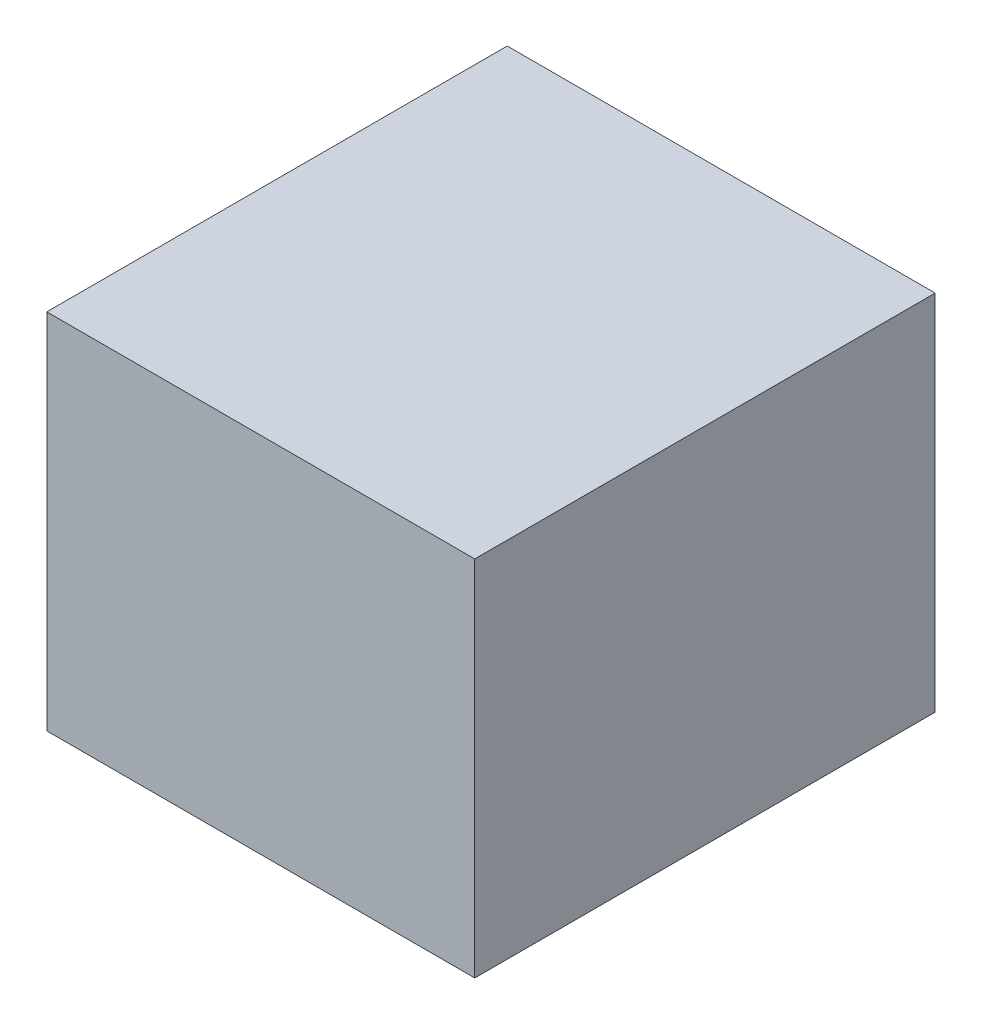
ISO-10303-21;
HEADER;
FILE_DESCRIPTION(('STEP AP214'),'2;1');
FILE_NAME('part.step','',(''),(''),'','','');
FILE_SCHEMA(('AUTOMOTIVE_DESIGN { 1 0 10303 214 1 1 1 1 }'));
ENDSEC;
DATA;
#1=APPLICATION_CONTEXT('core data for automotive mechanical design processes');
#2=APPLICATION_PROTOCOL_DEFINITION('international standard','automotive_design',2000,#1);
#3=PRODUCT_CONTEXT('',#1,'mechanical');
#4=PRODUCT('Part','Part','',(#3));
#5=PRODUCT_RELATED_PRODUCT_CATEGORY('part','',(#4));
#6=PRODUCT_DEFINITION_FORMATION('','',#4);
#7=PRODUCT_DEFINITION_CONTEXT('part definition',#1,'design');
#8=PRODUCT_DEFINITION('design','',#6,#7);
#9=PRODUCT_DEFINITION_SHAPE('','',#8);
#10=(LENGTH_UNIT() NAMED_UNIT(*) SI_UNIT(.MILLI.,.METRE.));
#11=(NAMED_UNIT(*) PLANE_ANGLE_UNIT() SI_UNIT($,.RADIAN.));
#12=(NAMED_UNIT(*) SI_UNIT($,.STERADIAN.) SOLID_ANGLE_UNIT());
#13=UNCERTAINTY_MEASURE_WITH_UNIT(LENGTH_MEASURE(1.E-05),#10,'distance_accuracy_value','');
#14=(GEOMETRIC_REPRESENTATION_CONTEXT(3) GLOBAL_UNCERTAINTY_ASSIGNED_CONTEXT((#13)) GLOBAL_UNIT_ASSIGNED_CONTEXT((#10,
#11,#12)) REPRESENTATION_CONTEXT('',''));
#15=CARTESIAN_POINT('',(0.,0.,0.));
#16=DIRECTION('',(0.,0.,1.));
#17=DIRECTION('',(1.,0.,0.));
#18=AXIS2_PLACEMENT_3D('',#15,#16,#17);
#19=CARTESIAN_POINT('',(-71.2244556930529,41.7430675909879,85.));
#20=DIRECTION('',(1.,0.,0.));
#21=DIRECTION('',(0.,0.,-1.));
#22=AXIS2_PLACEMENT_3D('',#19,#20,#21);
#23=PLANE('',#22);
#24=DIRECTION('',(0.,-1.,0.));
#25=VECTOR('',#24,1.);
#26=CARTESIAN_POINT('',(-71.2244556930529,41.7430675909879,0.));
#27=LINE('',#26,#25);
#28=CARTESIAN_POINT('',(-71.2244556930529,41.7430675909879,0.));
#29=VERTEX_POINT('',#28);
#30=CARTESIAN_POINT('',(-71.2244556930529,-25.2569324090121,0.));
#31=VERTEX_POINT('',#30);
#32=EDGE_CURVE('E107',#29,#31,#27,.T.);
#33=ORIENTED_EDGE('',*,*,#32,.T.);
#34=DIRECTION('',(0.,0.,-1.));
#35=VECTOR('',#34,1.);
#36=CARTESIAN_POINT('',(-71.2244556930529,-25.2569324090121,85.));
#37=LINE('',#36,#35);
#38=CARTESIAN_POINT('',(-71.2244556930529,-25.2569324090121,85.));
#39=VERTEX_POINT('',#38);
#40=EDGE_CURVE('E11',#39,#31,#37,.T.);
#41=ORIENTED_EDGE('',*,*,#40,.F.);
#42=DIRECTION('',(0.,-1.,0.));
#43=VECTOR('',#42,1.);
#44=CARTESIAN_POINT('',(-71.2244556930529,41.7430675909879,85.));
#45=LINE('',#44,#43);
#46=CARTESIAN_POINT('',(-71.2244556930529,41.7430675909879,85.));
#47=VERTEX_POINT('',#46);
#48=EDGE_CURVE('E91',#47,#39,#45,.T.);
#49=ORIENTED_EDGE('',*,*,#48,.F.);
#50=DIRECTION('',(0.,0.,-1.));
#51=VECTOR('',#50,1.);
#52=CARTESIAN_POINT('',(-71.2244556930529,41.7430675909879,85.));
#53=LINE('',#52,#51);
#54=EDGE_CURVE('E103',#47,#29,#53,.T.);
#55=ORIENTED_EDGE('',*,*,#54,.T.);
#56=EDGE_LOOP('',(#33,#41,#49,#55));
#57=FACE_BOUND('',#56,.T.);
#58=ADVANCED_FACE('F39',(#57),#23,.F.);
#59=CARTESIAN_POINT('',(-71.2244556930529,-25.2569324090121,85.));
#60=DIRECTION('',(0.,1.,0.));
#61=DIRECTION('',(0.,0.,1.));
#62=AXIS2_PLACEMENT_3D('',#59,#60,#61);
#63=PLANE('',#62);
#64=DIRECTION('',(1.,0.,0.));
#65=VECTOR('',#64,1.);
#66=CARTESIAN_POINT('',(-71.2244556930529,-25.2569324090121,0.));
#67=LINE('',#66,#65);
#68=CARTESIAN_POINT('',(7.77554430694716,-25.2569324090121,0.));
#69=VERTEX_POINT('',#68);
#70=EDGE_CURVE('E96',#31,#69,#67,.T.);
#71=ORIENTED_EDGE('',*,*,#70,.T.);
#72=DIRECTION('',(0.,0.,-1.));
#73=VECTOR('',#72,1.);
#74=CARTESIAN_POINT('',(7.77554430694716,-25.2569324090121,85.));
#75=LINE('',#74,#73);
#76=CARTESIAN_POINT('',(7.77554430694716,-25.2569324090121,85.));
#77=VERTEX_POINT('',#76);
#78=EDGE_CURVE('E48',#77,#69,#75,.T.);
#79=ORIENTED_EDGE('',*,*,#78,.F.);
#80=DIRECTION('',(1.,0.,0.));
#81=VECTOR('',#80,1.);
#82=CARTESIAN_POINT('',(-71.2244556930529,-25.2569324090121,85.));
#83=LINE('',#82,#81);
#84=EDGE_CURVE('E86',#39,#77,#83,.T.);
#85=ORIENTED_EDGE('',*,*,#84,.F.);
#86=ORIENTED_EDGE('',*,*,#40,.T.);
#87=EDGE_LOOP('',(#71,#79,#85,#86));
#88=FACE_BOUND('',#87,.T.);
#89=ADVANCED_FACE('F95',(#88),#63,.F.);
#90=CARTESIAN_POINT('',(7.77554430694714,41.7430675909879,85.));
#91=DIRECTION('',(-1.,0.,0.));
#92=DIRECTION('',(0.,-1.,0.));
#93=AXIS2_PLACEMENT_3D('',#90,#91,#92);
#94=PLANE('',#93);
#95=DIRECTION('',(0.,1.,0.));
#96=VECTOR('',#95,1.);
#97=CARTESIAN_POINT('',(7.77554430694714,41.7430675909879,0.));
#98=LINE('',#97,#96);
#99=CARTESIAN_POINT('',(7.77554430694714,41.7430675909879,0.));
#100=VERTEX_POINT('',#99);
#101=EDGE_CURVE('E73',#69,#100,#98,.T.);
#102=ORIENTED_EDGE('',*,*,#101,.T.);
#103=DIRECTION('',(0.,0.,-1.));
#104=VECTOR('',#103,1.);
#105=CARTESIAN_POINT('',(7.77554430694714,41.7430675909879,85.));
#106=LINE('',#105,#104);
#107=CARTESIAN_POINT('',(7.77554430694714,41.7430675909879,85.));
#108=VERTEX_POINT('',#107);
#109=EDGE_CURVE('E98',#108,#100,#106,.T.);
#110=ORIENTED_EDGE('',*,*,#109,.F.);
#111=DIRECTION('',(0.,1.,0.));
#112=VECTOR('',#111,1.);
#113=CARTESIAN_POINT('',(7.77554430694714,41.7430675909879,85.));
#114=LINE('',#113,#112);
#115=EDGE_CURVE('E89',#77,#108,#114,.T.);
#116=ORIENTED_EDGE('',*,*,#115,.F.);
#117=ORIENTED_EDGE('',*,*,#78,.T.);
#118=EDGE_LOOP('',(#102,#110,#116,#117));
#119=FACE_BOUND('',#118,.T.);
#120=ADVANCED_FACE('F99',(#119),#94,.F.);
#121=CARTESIAN_POINT('',(-71.2244556930529,41.7430675909879,85.));
#122=DIRECTION('',(0.,-1.,0.));
#123=DIRECTION('',(0.,0.,-1.));
#124=AXIS2_PLACEMENT_3D('',#121,#122,#123);
#125=PLANE('',#124);
#126=DIRECTION('',(-1.,0.,0.));
#127=VECTOR('',#126,1.);
#128=CARTESIAN_POINT('',(-71.2244556930529,41.7430675909879,0.));
#129=LINE('',#128,#127);
#130=EDGE_CURVE('E79',#100,#29,#129,.T.);
#131=ORIENTED_EDGE('',*,*,#130,.T.);
#132=ORIENTED_EDGE('',*,*,#54,.F.);
#133=DIRECTION('',(-1.,0.,0.));
#134=VECTOR('',#133,1.);
#135=CARTESIAN_POINT('',(-71.2244556930529,41.7430675909879,85.));
#136=LINE('',#135,#134);
#137=EDGE_CURVE('E56',#108,#47,#136,.T.);
#138=ORIENTED_EDGE('',*,*,#137,.F.);
#139=ORIENTED_EDGE('',*,*,#109,.T.);
#140=EDGE_LOOP('',(#131,#132,#138,#139));
#141=FACE_BOUND('',#140,.T.);
#142=ADVANCED_FACE('F120',(#141),#125,.F.);
#143=CARTESIAN_POINT('',(0.,0.,85.));
#144=DIRECTION('',(0.,0.,1.));
#145=DIRECTION('',(1.,0.,0.));
#146=AXIS2_PLACEMENT_3D('',#143,#144,#145);
#147=PLANE('',#146);
#148=ORIENTED_EDGE('',*,*,#48,.T.);
#149=ORIENTED_EDGE('',*,*,#84,.T.);
#150=ORIENTED_EDGE('',*,*,#115,.T.);
#151=ORIENTED_EDGE('',*,*,#137,.T.);
#152=EDGE_LOOP('',(#148,#149,#150,#151));
#153=FACE_BOUND('',#152,.T.);
#154=ADVANCED_FACE('F87',(#153),#147,.T.);
#155=CARTESIAN_POINT('',(0.,0.,0.));
#156=DIRECTION('',(0.,0.,1.));
#157=DIRECTION('',(1.,0.,0.));
#158=AXIS2_PLACEMENT_3D('',#155,#156,#157);
#159=PLANE('',#158);
#160=ORIENTED_EDGE('',*,*,#32,.F.);
#161=ORIENTED_EDGE('',*,*,#130,.F.);
#162=ORIENTED_EDGE('',*,*,#101,.F.);
#163=ORIENTED_EDGE('',*,*,#70,.F.);
#164=EDGE_LOOP('',(#160,#161,#162,#163));
#165=FACE_BOUND('',#164,.T.);
#166=ADVANCED_FACE('F123',(#165),#159,.F.);
#167=CLOSED_SHELL('',(#58,#89,#120,#142,#154,#166));
#168=MANIFOLD_SOLID_BREP('B2',#167);
#169=ADVANCED_BREP_SHAPE_REPRESENTATION('',(#18,#168),#14);
#170=SHAPE_DEFINITION_REPRESENTATION(#9,#169);
ENDSEC;
END-ISO-10303-21;
